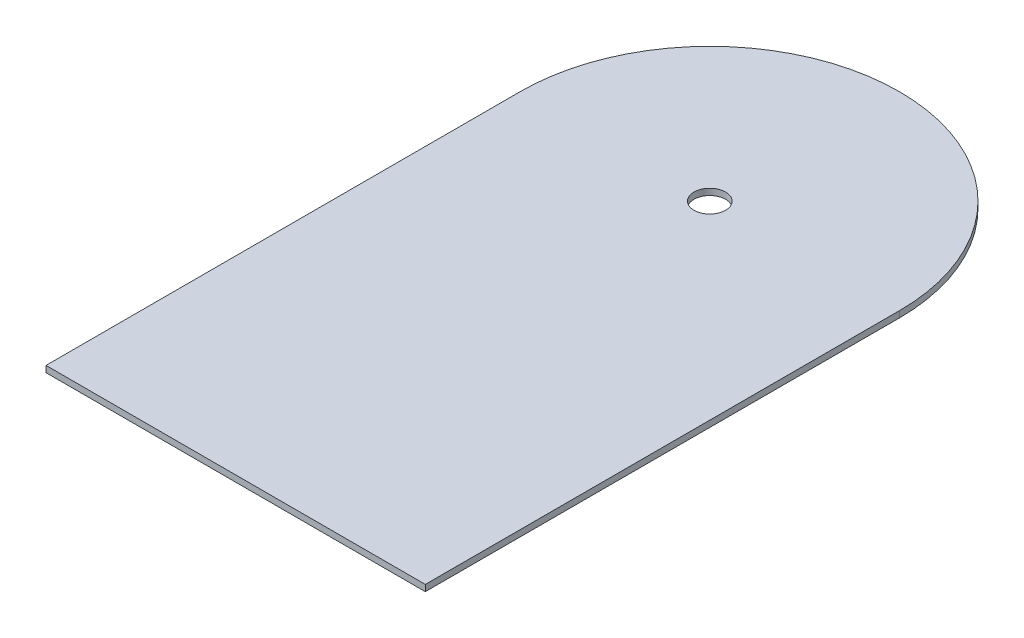
ISO-10303-21;
HEADER;
FILE_DESCRIPTION(('STEP AP214'),'2;1');
FILE_NAME('part.step','',(''),(''),'','','');
FILE_SCHEMA(('AUTOMOTIVE_DESIGN { 1 0 10303 214 1 1 1 1 }'));
ENDSEC;
DATA;
#1=APPLICATION_CONTEXT('core data for automotive mechanical design processes');
#2=APPLICATION_PROTOCOL_DEFINITION('international standard','automotive_design',2000,#1);
#3=PRODUCT_CONTEXT('',#1,'mechanical');
#4=PRODUCT('Part','Part','',(#3));
#5=PRODUCT_RELATED_PRODUCT_CATEGORY('part','',(#4));
#6=PRODUCT_DEFINITION_FORMATION('','',#4);
#7=PRODUCT_DEFINITION_CONTEXT('part definition',#1,'design');
#8=PRODUCT_DEFINITION('design','',#6,#7);
#9=PRODUCT_DEFINITION_SHAPE('','',#8);
#10=(LENGTH_UNIT() NAMED_UNIT(*) SI_UNIT(.MILLI.,.METRE.));
#11=(NAMED_UNIT(*) PLANE_ANGLE_UNIT() SI_UNIT($,.RADIAN.));
#12=(NAMED_UNIT(*) SI_UNIT($,.STERADIAN.) SOLID_ANGLE_UNIT());
#13=UNCERTAINTY_MEASURE_WITH_UNIT(LENGTH_MEASURE(1.E-05),#10,'distance_accuracy_value','');
#14=(GEOMETRIC_REPRESENTATION_CONTEXT(3) GLOBAL_UNCERTAINTY_ASSIGNED_CONTEXT((#13)) GLOBAL_UNIT_ASSIGNED_CONTEXT((#10,
#11,#12)) REPRESENTATION_CONTEXT('',''));
#15=CARTESIAN_POINT('',(0.,0.,0.));
#16=DIRECTION('',(0.,0.,1.));
#17=DIRECTION('',(1.,0.,0.));
#18=AXIS2_PLACEMENT_3D('',#15,#16,#17);
#19=CARTESIAN_POINT('',(0.,10.8205609664375,0.));
#20=DIRECTION('',(0.,1.,0.));
#21=DIRECTION('',(-1.,0.,0.));
#22=AXIS2_PLACEMENT_3D('',#19,#20,#21);
#23=PLANE('',#22);
#24=CARTESIAN_POINT('',(0.,10.8205609664375,0.));
#25=DIRECTION('',(0.,1.,0.));
#26=DIRECTION('',(-1.,0.,0.));
#27=AXIS2_PLACEMENT_3D('',#24,#25,#26);
#28=CIRCLE('',#27,30.);
#29=CARTESIAN_POINT('',(30.,10.8205609664375,0.));
#30=VERTEX_POINT('',#29);
#31=CARTESIAN_POINT('',(-30.,10.8205609664375,0.));
#32=VERTEX_POINT('',#31);
#33=EDGE_CURVE('E85',#30,#32,#28,.T.);
#34=ORIENTED_EDGE('',*,*,#33,.T.);
#35=DIRECTION('',(0.,0.,1.));
#36=VECTOR('',#35,1.);
#37=CARTESIAN_POINT('',(-30.,10.8205609664375,0.));
#38=LINE('',#37,#36);
#39=CARTESIAN_POINT('',(-30.,10.8205609664375,75.));
#40=VERTEX_POINT('',#39);
#41=EDGE_CURVE('E80',#32,#40,#38,.T.);
#42=ORIENTED_EDGE('',*,*,#41,.T.);
#43=DIRECTION('',(1.,0.,0.));
#44=VECTOR('',#43,1.);
#45=CARTESIAN_POINT('',(-30.,10.8205609664375,75.));
#46=LINE('',#45,#44);
#47=CARTESIAN_POINT('',(30.,10.8205609664375,75.));
#48=VERTEX_POINT('',#47);
#49=EDGE_CURVE('E83',#40,#48,#46,.T.);
#50=ORIENTED_EDGE('',*,*,#49,.T.);
#51=DIRECTION('',(0.,0.,-1.));
#52=VECTOR('',#51,1.);
#53=CARTESIAN_POINT('',(30.,10.8205609664375,75.));
#54=LINE('',#53,#52);
#55=EDGE_CURVE('E50',#48,#30,#54,.T.);
#56=ORIENTED_EDGE('',*,*,#55,.T.);
#57=EDGE_LOOP('',(#34,#42,#50,#56));
#58=FACE_BOUND('',#57,.T.);
#59=CARTESIAN_POINT('',(0.,10.8205609664375,0.));
#60=DIRECTION('',(0.,1.,0.));
#61=DIRECTION('',(-1.,0.,0.));
#62=AXIS2_PLACEMENT_3D('',#59,#60,#61);
#63=CIRCLE('',#62,2.5);
#64=CARTESIAN_POINT('',(-2.50000000000001,10.8205609664375,0.));
#65=VERTEX_POINT('',#64);
#66=EDGE_CURVE('E100',#65,#65,#63,.T.);
#67=ORIENTED_EDGE('',*,*,#66,.F.);
#68=EDGE_LOOP('',(#67));
#69=FACE_BOUND('',#68,.T.);
#70=ADVANCED_FACE('F33',(#58,#69),#23,.T.);
#71=CARTESIAN_POINT('',(0.,9.82056096643749,0.));
#72=DIRECTION('',(0.,1.,0.));
#73=DIRECTION('',(-1.,0.,0.));
#74=AXIS2_PLACEMENT_3D('',#71,#72,#73);
#75=PLANE('',#74);
#76=CARTESIAN_POINT('',(0.,9.82056096643749,0.));
#77=DIRECTION('',(0.,1.,0.));
#78=DIRECTION('',(-1.,0.,0.));
#79=AXIS2_PLACEMENT_3D('',#76,#77,#78);
#80=CIRCLE('',#79,30.);
#81=CARTESIAN_POINT('',(30.,9.82056096643749,0.));
#82=VERTEX_POINT('',#81);
#83=CARTESIAN_POINT('',(-30.,9.82056096643748,0.));
#84=VERTEX_POINT('',#83);
#85=EDGE_CURVE('E97',#82,#84,#80,.T.);
#86=ORIENTED_EDGE('',*,*,#85,.F.);
#87=DIRECTION('',(0.,0.,-1.));
#88=VECTOR('',#87,1.);
#89=CARTESIAN_POINT('',(30.,9.82056096643749,75.));
#90=LINE('',#89,#88);
#91=CARTESIAN_POINT('',(30.,9.82056096643749,75.));
#92=VERTEX_POINT('',#91);
#93=EDGE_CURVE('E73',#92,#82,#90,.T.);
#94=ORIENTED_EDGE('',*,*,#93,.F.);
#95=DIRECTION('',(1.,0.,0.));
#96=VECTOR('',#95,1.);
#97=CARTESIAN_POINT('',(-30.,9.82056096643748,75.));
#98=LINE('',#97,#96);
#99=CARTESIAN_POINT('',(-30.,9.82056096643748,75.));
#100=VERTEX_POINT('',#99);
#101=EDGE_CURVE('E67',#100,#92,#98,.T.);
#102=ORIENTED_EDGE('',*,*,#101,.F.);
#103=DIRECTION('',(0.,0.,1.));
#104=VECTOR('',#103,1.);
#105=CARTESIAN_POINT('',(-30.,9.82056096643748,0.));
#106=LINE('',#105,#104);
#107=EDGE_CURVE('E89',#84,#100,#106,.T.);
#108=ORIENTED_EDGE('',*,*,#107,.F.);
#109=EDGE_LOOP('',(#86,#94,#102,#108));
#110=FACE_BOUND('',#109,.T.);
#111=CARTESIAN_POINT('',(0.,9.82056096643749,0.));
#112=DIRECTION('',(0.,1.,0.));
#113=DIRECTION('',(-1.,0.,0.));
#114=AXIS2_PLACEMENT_3D('',#111,#112,#113);
#115=CIRCLE('',#114,2.5);
#116=CARTESIAN_POINT('',(-2.50000000000001,9.82056096643749,0.));
#117=VERTEX_POINT('',#116);
#118=EDGE_CURVE('E112',#117,#117,#115,.T.);
#119=ORIENTED_EDGE('',*,*,#118,.T.);
#120=EDGE_LOOP('',(#119));
#121=FACE_BOUND('',#120,.T.);
#122=ADVANCED_FACE('F108',(#110,#121),#75,.F.);
#123=CARTESIAN_POINT('',(0.,10.8205609664375,0.));
#124=DIRECTION('',(0.,-1.,0.));
#125=DIRECTION('',(1.,0.,0.));
#126=AXIS2_PLACEMENT_3D('',#123,#124,#125);
#127=CYLINDRICAL_SURFACE('',#126,30.);
#128=ORIENTED_EDGE('',*,*,#85,.T.);
#129=DIRECTION('',(0.,-1.,0.));
#130=VECTOR('',#129,1.);
#131=CARTESIAN_POINT('',(-30.,10.8205609664375,0.));
#132=LINE('',#131,#130);
#133=EDGE_CURVE('E11',#32,#84,#132,.T.);
#134=ORIENTED_EDGE('',*,*,#133,.F.);
#135=ORIENTED_EDGE('',*,*,#33,.F.);
#136=DIRECTION('',(0.,-1.,0.));
#137=VECTOR('',#136,1.);
#138=CARTESIAN_POINT('',(30.,10.8205609664375,0.));
#139=LINE('',#138,#137);
#140=EDGE_CURVE('E93',#30,#82,#139,.T.);
#141=ORIENTED_EDGE('',*,*,#140,.T.);
#142=EDGE_LOOP('',(#128,#134,#135,#141));
#143=FACE_BOUND('',#142,.T.);
#144=ADVANCED_FACE('F35',(#143),#127,.T.);
#145=CARTESIAN_POINT('',(-30.,10.8205609664375,0.));
#146=DIRECTION('',(1.,0.,0.));
#147=DIRECTION('',(0.,1.,0.));
#148=AXIS2_PLACEMENT_3D('',#145,#146,#147);
#149=PLANE('',#148);
#150=ORIENTED_EDGE('',*,*,#107,.T.);
#151=DIRECTION('',(0.,-1.,0.));
#152=VECTOR('',#151,1.);
#153=CARTESIAN_POINT('',(-30.,10.8205609664375,75.));
#154=LINE('',#153,#152);
#155=EDGE_CURVE('E42',#40,#100,#154,.T.);
#156=ORIENTED_EDGE('',*,*,#155,.F.);
#157=ORIENTED_EDGE('',*,*,#41,.F.);
#158=ORIENTED_EDGE('',*,*,#133,.T.);
#159=EDGE_LOOP('',(#150,#156,#157,#158));
#160=FACE_BOUND('',#159,.T.);
#161=ADVANCED_FACE('F88',(#160),#149,.F.);
#162=CARTESIAN_POINT('',(-30.,10.8205609664375,75.));
#163=DIRECTION('',(0.,0.,-1.));
#164=DIRECTION('',(-1.,0.,0.));
#165=AXIS2_PLACEMENT_3D('',#162,#163,#164);
#166=PLANE('',#165);
#167=ORIENTED_EDGE('',*,*,#101,.T.);
#168=DIRECTION('',(0.,-1.,0.));
#169=VECTOR('',#168,1.);
#170=CARTESIAN_POINT('',(30.,10.8205609664375,75.));
#171=LINE('',#170,#169);
#172=EDGE_CURVE('E90',#48,#92,#171,.T.);
#173=ORIENTED_EDGE('',*,*,#172,.F.);
#174=ORIENTED_EDGE('',*,*,#49,.F.);
#175=ORIENTED_EDGE('',*,*,#155,.T.);
#176=EDGE_LOOP('',(#167,#173,#174,#175));
#177=FACE_BOUND('',#176,.T.);
#178=ADVANCED_FACE('F91',(#177),#166,.F.);
#179=CARTESIAN_POINT('',(30.,10.8205609664375,75.));
#180=DIRECTION('',(-1.,0.,0.));
#181=DIRECTION('',(0.,-1.,0.));
#182=AXIS2_PLACEMENT_3D('',#179,#180,#181);
#183=PLANE('',#182);
#184=ORIENTED_EDGE('',*,*,#93,.T.);
#185=ORIENTED_EDGE('',*,*,#140,.F.);
#186=ORIENTED_EDGE('',*,*,#55,.F.);
#187=ORIENTED_EDGE('',*,*,#172,.T.);
#188=EDGE_LOOP('',(#184,#185,#186,#187));
#189=FACE_BOUND('',#188,.T.);
#190=ADVANCED_FACE('F105',(#189),#183,.F.);
#191=CARTESIAN_POINT('',(0.,10.8205609664375,0.));
#192=DIRECTION('',(0.,-1.,0.));
#193=DIRECTION('',(1.,0.,0.));
#194=AXIS2_PLACEMENT_3D('',#191,#192,#193);
#195=CYLINDRICAL_SURFACE('',#194,2.5);
#196=ORIENTED_EDGE('',*,*,#66,.T.);
#197=EDGE_LOOP('',(#196));
#198=FACE_BOUND('',#197,.T.);
#199=ORIENTED_EDGE('',*,*,#118,.F.);
#200=EDGE_LOOP('',(#199));
#201=FACE_BOUND('',#200,.T.);
#202=ADVANCED_FACE('F118',(#198,#201),#195,.F.);
#203=CLOSED_SHELL('',(#70,#122,#144,#161,#178,#190,#202));
#204=MANIFOLD_SOLID_BREP('B2',#203);
#205=ADVANCED_BREP_SHAPE_REPRESENTATION('',(#18,#204),#14);
#206=SHAPE_DEFINITION_REPRESENTATION(#9,#205);
ENDSEC;
END-ISO-10303-21;
